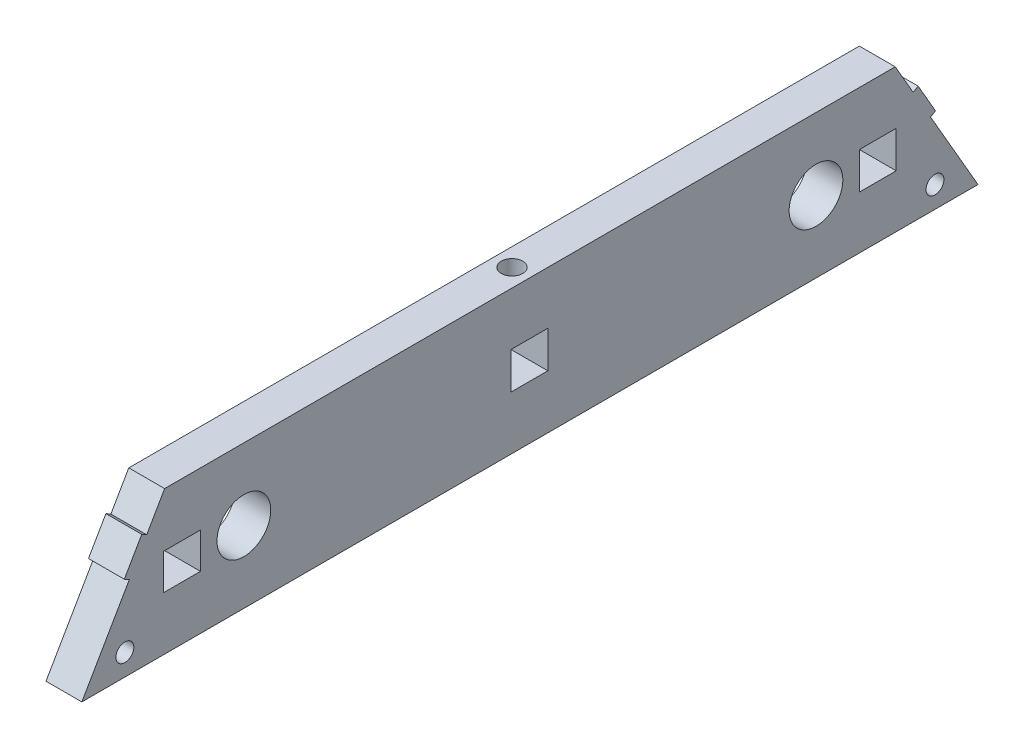
ISO-10303-21;
HEADER;
FILE_DESCRIPTION(('STEP AP214'),'2;1');
FILE_NAME('part.step','',(''),(''),'','','');
FILE_SCHEMA(('AUTOMOTIVE_DESIGN { 1 0 10303 214 1 1 1 1 }'));
ENDSEC;
DATA;
#1=APPLICATION_CONTEXT('core data for automotive mechanical design processes');
#2=APPLICATION_PROTOCOL_DEFINITION('international standard','automotive_design',2000,#1);
#3=PRODUCT_CONTEXT('',#1,'mechanical');
#4=PRODUCT('Part','Part','',(#3));
#5=PRODUCT_RELATED_PRODUCT_CATEGORY('part','',(#4));
#6=PRODUCT_DEFINITION_FORMATION('','',#4);
#7=PRODUCT_DEFINITION_CONTEXT('part definition',#1,'design');
#8=PRODUCT_DEFINITION('design','',#6,#7);
#9=PRODUCT_DEFINITION_SHAPE('','',#8);
#10=(LENGTH_UNIT() NAMED_UNIT(*) SI_UNIT(.MILLI.,.METRE.));
#11=(NAMED_UNIT(*) PLANE_ANGLE_UNIT() SI_UNIT($,.RADIAN.));
#12=(NAMED_UNIT(*) SI_UNIT($,.STERADIAN.) SOLID_ANGLE_UNIT());
#13=UNCERTAINTY_MEASURE_WITH_UNIT(LENGTH_MEASURE(1.E-05),#10,'distance_accuracy_value','');
#14=(GEOMETRIC_REPRESENTATION_CONTEXT(3) GLOBAL_UNCERTAINTY_ASSIGNED_CONTEXT((#13)) GLOBAL_UNIT_ASSIGNED_CONTEXT((#10,
#11,#12)) REPRESENTATION_CONTEXT('',''));
#15=CARTESIAN_POINT('',(0.,0.,0.));
#16=DIRECTION('',(0.,0.,1.));
#17=DIRECTION('',(1.,0.,0.));
#18=AXIS2_PLACEMENT_3D('',#15,#16,#17);
#19=CARTESIAN_POINT('',(6.35,0.,158.75));
#20=DIRECTION('',(0.,-0.500000000000004,-0.866025403784436));
#21=DIRECTION('',(0.,0.866025403784436,-0.500000000000004));
#22=AXIS2_PLACEMENT_3D('',#19,#20,#21);
#23=PLANE('',#22);
#24=DIRECTION('',(1.,0.,0.));
#25=VECTOR('',#24,1.);
#26=CARTESIAN_POINT('',(0.,14.5554566887305,150.346403162583));
#27=LINE('',#26,#25);
#28=CARTESIAN_POINT('',(0.,14.5554566887305,150.346403162583));
#29=VERTEX_POINT('',#28);
#30=CARTESIAN_POINT('',(6.35,14.5554566887305,150.346403162583));
#31=VERTEX_POINT('',#30);
#32=EDGE_CURVE('E405',#29,#31,#27,.T.);
#33=ORIENTED_EDGE('',*,*,#32,.F.);
#34=DIRECTION('',(0.,-0.866025403784436,0.500000000000004));
#35=VECTOR('',#34,1.);
#36=CARTESIAN_POINT('',(0.,0.,158.75));
#37=LINE('',#36,#35);
#38=CARTESIAN_POINT('',(0.,0.,158.75));
#39=VERTEX_POINT('',#38);
#40=EDGE_CURVE('E220',#29,#39,#37,.T.);
#41=ORIENTED_EDGE('',*,*,#40,.T.);
#42=DIRECTION('',(-1.,0.,0.));
#43=VECTOR('',#42,1.);
#44=CARTESIAN_POINT('',(6.35,0.,158.75));
#45=LINE('',#44,#43);
#46=CARTESIAN_POINT('',(6.35,0.,158.75));
#47=VERTEX_POINT('',#46);
#48=EDGE_CURVE('E374',#47,#39,#45,.T.);
#49=ORIENTED_EDGE('',*,*,#48,.F.);
#50=DIRECTION('',(0.,-0.866025403784436,0.500000000000004));
#51=VECTOR('',#50,1.);
#52=CARTESIAN_POINT('',(6.35,0.,158.75));
#53=LINE('',#52,#51);
#54=EDGE_CURVE('E49',#31,#47,#53,.T.);
#55=ORIENTED_EDGE('',*,*,#54,.F.);
#56=EDGE_LOOP('',(#33,#41,#49,#55));
#57=FACE_BOUND('',#56,.T.);
#58=ADVANCED_FACE('F33',(#57),#23,.F.);
#59=DIRECTION('',(-1.,0.,0.));
#60=VECTOR('',#59,1.);
#61=CARTESIAN_POINT('',(0.,19.9007386859688,147.260303162583));
#62=LINE('',#61,#60);
#63=CARTESIAN_POINT('',(6.35,19.9007386859688,147.260303162583));
#64=VERTEX_POINT('',#63);
#65=CARTESIAN_POINT('',(0.,19.9007386859688,147.260303162583));
#66=VERTEX_POINT('',#65);
#67=EDGE_CURVE('E57',#64,#66,#62,.T.);
#68=ORIENTED_EDGE('',*,*,#67,.F.);
#69=CARTESIAN_POINT('',(6.35,25.4,144.085303162583));
#70=VERTEX_POINT('',#69);
#71=EDGE_CURVE('E372',#70,#64,#53,.T.);
#72=ORIENTED_EDGE('',*,*,#71,.F.);
#73=DIRECTION('',(-1.,0.,0.));
#74=VECTOR('',#73,1.);
#75=CARTESIAN_POINT('',(6.35,25.4,144.085303162583));
#76=LINE('',#75,#74);
#77=CARTESIAN_POINT('',(0.,25.4,144.085303162583));
#78=VERTEX_POINT('',#77);
#79=EDGE_CURVE('E385',#70,#78,#76,.T.);
#80=ORIENTED_EDGE('',*,*,#79,.T.);
#81=EDGE_CURVE('E366',#78,#66,#37,.T.);
#82=ORIENTED_EDGE('',*,*,#81,.T.);
#83=EDGE_LOOP('',(#68,#72,#80,#82));
#84=FACE_BOUND('',#83,.T.);
#85=ADVANCED_FACE('F400',(#84),#23,.F.);
#86=CARTESIAN_POINT('',(6.35,0.,0.));
#87=DIRECTION('',(0.,-0.499999999999998,0.86602540378444));
#88=DIRECTION('',(0.,-0.86602540378444,-0.499999999999998));
#89=AXIS2_PLACEMENT_3D('',#86,#87,#88);
#90=PLANE('',#89);
#91=DIRECTION('',(-1.,0.,0.));
#92=VECTOR('',#91,1.);
#93=CARTESIAN_POINT('',(6.35,14.5554566887305,8.40359683741644));
#94=LINE('',#93,#92);
#95=CARTESIAN_POINT('',(6.35,14.5554566887305,8.40359683741644));
#96=VERTEX_POINT('',#95);
#97=CARTESIAN_POINT('',(0.,14.5554566887305,8.40359683741643));
#98=VERTEX_POINT('',#97);
#99=EDGE_CURVE('E221',#96,#98,#94,.T.);
#100=ORIENTED_EDGE('',*,*,#99,.F.);
#101=DIRECTION('',(0.,0.86602540378444,0.499999999999998));
#102=VECTOR('',#101,1.);
#103=CARTESIAN_POINT('',(6.35,0.,0.));
#104=LINE('',#103,#102);
#105=CARTESIAN_POINT('',(6.35,0.,0.));
#106=VERTEX_POINT('',#105);
#107=EDGE_CURVE('E367',#106,#96,#104,.T.);
#108=ORIENTED_EDGE('',*,*,#107,.F.);
#109=DIRECTION('',(-1.,0.,0.));
#110=VECTOR('',#109,1.);
#111=CARTESIAN_POINT('',(6.35,0.,0.));
#112=LINE('',#111,#110);
#113=CARTESIAN_POINT('',(0.,0.,0.));
#114=VERTEX_POINT('',#113);
#115=EDGE_CURVE('E11',#106,#114,#112,.T.);
#116=ORIENTED_EDGE('',*,*,#115,.T.);
#117=DIRECTION('',(0.,0.86602540378444,0.499999999999998));
#118=VECTOR('',#117,1.);
#119=CARTESIAN_POINT('',(0.,0.,0.));
#120=LINE('',#119,#118);
#121=EDGE_CURVE('E378',#114,#98,#120,.T.);
#122=ORIENTED_EDGE('',*,*,#121,.T.);
#123=EDGE_LOOP('',(#100,#108,#116,#122));
#124=FACE_BOUND('',#123,.T.);
#125=ADVANCED_FACE('F489',(#124),#90,.F.);
#126=DIRECTION('',(1.,0.,0.));
#127=VECTOR('',#126,1.);
#128=CARTESIAN_POINT('',(6.35,19.9007386859688,11.4896968374164));
#129=LINE('',#128,#127);
#130=CARTESIAN_POINT('',(0.,19.9007386859688,11.4896968374164));
#131=VERTEX_POINT('',#130);
#132=CARTESIAN_POINT('',(6.35,19.9007386859688,11.4896968374164));
#133=VERTEX_POINT('',#132);
#134=EDGE_CURVE('E224',#131,#133,#129,.T.);
#135=ORIENTED_EDGE('',*,*,#134,.F.);
#136=CARTESIAN_POINT('',(0.,25.4,14.6646968374164));
#137=VERTEX_POINT('',#136);
#138=EDGE_CURVE('E377',#131,#137,#120,.T.);
#139=ORIENTED_EDGE('',*,*,#138,.T.);
#140=DIRECTION('',(-1.,0.,0.));
#141=VECTOR('',#140,1.);
#142=CARTESIAN_POINT('',(6.35,25.4,14.6646968374164));
#143=LINE('',#142,#141);
#144=CARTESIAN_POINT('',(6.35,25.4,14.6646968374164));
#145=VERTEX_POINT('',#144);
#146=EDGE_CURVE('E42',#145,#137,#143,.T.);
#147=ORIENTED_EDGE('',*,*,#146,.F.);
#148=EDGE_CURVE('E365',#133,#145,#104,.T.);
#149=ORIENTED_EDGE('',*,*,#148,.F.);
#150=EDGE_LOOP('',(#135,#139,#147,#149));
#151=FACE_BOUND('',#150,.T.);
#152=ADVANCED_FACE('F437',(#151),#90,.F.);
#153=CARTESIAN_POINT('',(6.35,0.,0.));
#154=DIRECTION('',(-1.,0.,0.));
#155=DIRECTION('',(0.,0.,1.));
#156=AXIS2_PLACEMENT_3D('',#153,#154,#155);
#157=PLANE('',#156);
#158=CARTESIAN_POINT('',(6.35,3.80999999999998,7.62));
#159=DIRECTION('',(1.,0.,0.));
#160=DIRECTION('',(0.,0.,-1.));
#161=AXIS2_PLACEMENT_3D('',#158,#159,#160);
#162=CIRCLE('',#161,1.5875);
#163=CARTESIAN_POINT('',(6.35,3.80999999999998,6.0325));
#164=VERTEX_POINT('',#163);
#165=EDGE_CURVE('E419',#164,#164,#162,.T.);
#166=ORIENTED_EDGE('',*,*,#165,.F.);
#167=EDGE_LOOP('',(#166));
#168=FACE_BOUND('',#167,.T.);
#169=CARTESIAN_POINT('',(6.35,3.80999999999999,151.13));
#170=DIRECTION('',(1.,0.,0.));
#171=DIRECTION('',(0.,0.,-1.));
#172=AXIS2_PLACEMENT_3D('',#169,#170,#171);
#173=CIRCLE('',#172,1.58749999999999);
#174=CARTESIAN_POINT('',(6.35,3.80999999999999,149.5425));
#175=VERTEX_POINT('',#174);
#176=EDGE_CURVE('E413',#175,#175,#173,.T.);
#177=ORIENTED_EDGE('',*,*,#176,.F.);
#178=EDGE_LOOP('',(#177));
#179=FACE_BOUND('',#178,.T.);
#180=DIRECTION('',(0.,0.,-1.));
#181=VECTOR('',#180,1.);
#182=CARTESIAN_POINT('',(6.35,9.52616277871034,137.735303162583));
#183=LINE('',#182,#181);
#184=CARTESIAN_POINT('',(6.35,9.52616277871034,144.263103162583));
#185=VERTEX_POINT('',#184);
#186=CARTESIAN_POINT('',(6.35,9.52616277871034,137.735303162583));
#187=VERTEX_POINT('',#186);
#188=EDGE_CURVE('E288',#185,#187,#183,.T.);
#189=ORIENTED_EDGE('',*,*,#188,.F.);
#190=DIRECTION('',(0.,-1.,0.));
#191=VECTOR('',#190,1.);
#192=CARTESIAN_POINT('',(6.35,9.52616277871034,144.263103162583));
#193=LINE('',#192,#191);
#194=CARTESIAN_POINT('',(6.35,15.875,144.263103162583));
#195=VERTEX_POINT('',#194);
#196=EDGE_CURVE('E296',#195,#185,#193,.T.);
#197=ORIENTED_EDGE('',*,*,#196,.F.);
#198=DIRECTION('',(0.,0.,1.));
#199=VECTOR('',#198,1.);
#200=CARTESIAN_POINT('',(6.35,15.875,137.735303162583));
#201=LINE('',#200,#199);
#202=CARTESIAN_POINT('',(6.35,15.875,137.735303162583));
#203=VERTEX_POINT('',#202);
#204=EDGE_CURVE('E293',#203,#195,#201,.T.);
#205=ORIENTED_EDGE('',*,*,#204,.F.);
#206=DIRECTION('',(0.,1.,0.));
#207=VECTOR('',#206,1.);
#208=CARTESIAN_POINT('',(6.35,9.52616277871034,137.735303162583));
#209=LINE('',#208,#207);
#210=EDGE_CURVE('E290',#187,#203,#209,.T.);
#211=ORIENTED_EDGE('',*,*,#210,.F.);
#212=EDGE_LOOP('',(#189,#197,#205,#211));
#213=FACE_BOUND('',#212,.T.);
#214=CARTESIAN_POINT('',(6.35,12.7,130.048));
#215=DIRECTION('',(1.,0.,0.));
#216=DIRECTION('',(0.,0.,-1.));
#217=AXIS2_PLACEMENT_3D('',#214,#215,#216);
#218=CIRCLE('',#217,4.76250000000001);
#219=CARTESIAN_POINT('',(6.35,12.7,125.2855));
#220=VERTEX_POINT('',#219);
#221=EDGE_CURVE('E325',#220,#220,#218,.T.);
#222=ORIENTED_EDGE('',*,*,#221,.F.);
#223=EDGE_LOOP('',(#222));
#224=FACE_BOUND('',#223,.T.);
#225=DIRECTION('',(0.,0.,-1.));
#226=VECTOR('',#225,1.);
#227=CARTESIAN_POINT('',(6.35,0.,0.));
#228=LINE('',#227,#226);
#229=EDGE_CURVE('E362',#47,#106,#228,.T.);
#230=ORIENTED_EDGE('',*,*,#229,.T.);
#231=ORIENTED_EDGE('',*,*,#107,.T.);
#232=DIRECTION('',(0.,-0.499999999999998,0.86602540378444));
#233=VECTOR('',#232,1.);
#234=CARTESIAN_POINT('',(6.35,15.0634566887305,7.52371502717144));
#235=LINE('',#234,#233);
#236=CARTESIAN_POINT('',(6.35,15.0634566887305,7.52371502717144));
#237=VERTEX_POINT('',#236);
#238=EDGE_CURVE('E250',#237,#96,#235,.T.);
#239=ORIENTED_EDGE('',*,*,#238,.F.);
#240=DIRECTION('',(0.,-0.86602540378444,-0.499999999999998));
#241=VECTOR('',#240,1.);
#242=CARTESIAN_POINT('',(6.35,20.4087386859688,10.6098150271714));
#243=LINE('',#242,#241);
#244=CARTESIAN_POINT('',(6.35,20.4087386859688,10.6098150271714));
#245=VERTEX_POINT('',#244);
#246=EDGE_CURVE('E230',#245,#237,#243,.T.);
#247=ORIENTED_EDGE('',*,*,#246,.F.);
#248=DIRECTION('',(0.,-0.499999999999998,0.86602540378444));
#249=VECTOR('',#248,1.);
#250=CARTESIAN_POINT('',(6.35,20.4087386859688,10.6098150271714));
#251=LINE('',#250,#249);
#252=EDGE_CURVE('E238',#245,#133,#251,.T.);
#253=ORIENTED_EDGE('',*,*,#252,.T.);
#254=ORIENTED_EDGE('',*,*,#148,.T.);
#255=DIRECTION('',(0.,0.,1.));
#256=VECTOR('',#255,1.);
#257=CARTESIAN_POINT('',(6.35,25.4,14.6646968374164));
#258=LINE('',#257,#256);
#259=EDGE_CURVE('E370',#145,#70,#258,.T.);
#260=ORIENTED_EDGE('',*,*,#259,.T.);
#261=ORIENTED_EDGE('',*,*,#71,.T.);
#262=DIRECTION('',(0.,-0.500000000000004,-0.866025403784436));
#263=VECTOR('',#262,1.);
#264=CARTESIAN_POINT('',(6.35,20.4087386859688,148.140184972828));
#265=LINE('',#264,#263);
#266=CARTESIAN_POINT('',(6.35,20.4087386859688,148.140184972828));
#267=VERTEX_POINT('',#266);
#268=EDGE_CURVE('E226',#267,#64,#265,.T.);
#269=ORIENTED_EDGE('',*,*,#268,.F.);
#270=DIRECTION('',(0.,0.866025403784436,-0.500000000000005));
#271=VECTOR('',#270,1.);
#272=CARTESIAN_POINT('',(6.35,20.4087386859688,148.140184972828));
#273=LINE('',#272,#271);
#274=CARTESIAN_POINT('',(6.35,15.0634566887305,151.226284972828));
#275=VERTEX_POINT('',#274);
#276=EDGE_CURVE('E205',#275,#267,#273,.T.);
#277=ORIENTED_EDGE('',*,*,#276,.F.);
#278=DIRECTION('',(0.,-0.500000000000004,-0.866025403784436));
#279=VECTOR('',#278,1.);
#280=CARTESIAN_POINT('',(6.35,15.0634566887305,151.226284972828));
#281=LINE('',#280,#279);
#282=EDGE_CURVE('E202',#275,#31,#281,.T.);
#283=ORIENTED_EDGE('',*,*,#282,.T.);
#284=ORIENTED_EDGE('',*,*,#54,.T.);
#285=EDGE_LOOP('',(#230,#231,#239,#247,#253,#254,#260,#261,#269,#277,#283,#284));
#286=FACE_BOUND('',#285,.T.);
#287=DIRECTION('',(0.,-1.,0.));
#288=VECTOR('',#287,1.);
#289=CARTESIAN_POINT('',(6.35,9.34719999999998,21.0146968374163));
#290=LINE('',#289,#288);
#291=CARTESIAN_POINT('',(6.35,15.875,21.0146968374163));
#292=VERTEX_POINT('',#291);
#293=CARTESIAN_POINT('',(6.35,9.34719999999998,21.0146968374163));
#294=VERTEX_POINT('',#293);
#295=EDGE_CURVE('E331',#292,#294,#290,.T.);
#296=ORIENTED_EDGE('',*,*,#295,.F.);
#297=DIRECTION('',(0.,0.,1.));
#298=VECTOR('',#297,1.);
#299=CARTESIAN_POINT('',(6.35,15.875,21.0146968374163));
#300=LINE('',#299,#298);
#301=CARTESIAN_POINT('',(6.35,15.875,14.4868968374164));
#302=VERTEX_POINT('',#301);
#303=EDGE_CURVE('E339',#302,#292,#300,.T.);
#304=ORIENTED_EDGE('',*,*,#303,.F.);
#305=DIRECTION('',(0.,1.,0.));
#306=VECTOR('',#305,1.);
#307=CARTESIAN_POINT('',(6.35,9.34719999999998,14.4868968374164));
#308=LINE('',#307,#306);
#309=CARTESIAN_POINT('',(6.35,9.34719999999998,14.4868968374164));
#310=VERTEX_POINT('',#309);
#311=EDGE_CURVE('E336',#310,#302,#308,.T.);
#312=ORIENTED_EDGE('',*,*,#311,.F.);
#313=DIRECTION('',(0.,0.,-1.));
#314=VECTOR('',#313,1.);
#315=CARTESIAN_POINT('',(6.35,9.34719999999998,21.0146968374163));
#316=LINE('',#315,#314);
#317=EDGE_CURVE('E333',#294,#310,#316,.T.);
#318=ORIENTED_EDGE('',*,*,#317,.F.);
#319=EDGE_LOOP('',(#296,#304,#312,#318));
#320=FACE_BOUND('',#319,.T.);
#321=CARTESIAN_POINT('',(6.35,12.7,28.702));
#322=DIRECTION('',(1.,0.,0.));
#323=DIRECTION('',(0.,0.,-1.));
#324=AXIS2_PLACEMENT_3D('',#321,#322,#323);
#325=CIRCLE('',#324,4.7625);
#326=CARTESIAN_POINT('',(6.35,12.7,23.9395));
#327=VERTEX_POINT('',#326);
#328=EDGE_CURVE('E319',#327,#327,#325,.T.);
#329=ORIENTED_EDGE('',*,*,#328,.F.);
#330=EDGE_LOOP('',(#329));
#331=FACE_BOUND('',#330,.T.);
#332=DIRECTION('',(0.,1.,0.));
#333=VECTOR('',#332,1.);
#334=CARTESIAN_POINT('',(6.35,16.0527999999999,76.2));
#335=LINE('',#334,#333);
#336=CARTESIAN_POINT('',(6.35,9.52499999999995,76.2));
#337=VERTEX_POINT('',#336);
#338=CARTESIAN_POINT('',(6.35,16.0527999999999,76.2));
#339=VERTEX_POINT('',#338);
#340=EDGE_CURVE('E256',#337,#339,#335,.T.);
#341=ORIENTED_EDGE('',*,*,#340,.F.);
#342=DIRECTION('',(0.,0.,-1.));
#343=VECTOR('',#342,1.);
#344=CARTESIAN_POINT('',(6.35,9.52499999999995,76.2));
#345=LINE('',#344,#343);
#346=CARTESIAN_POINT('',(6.35,9.52499999999995,82.7278));
#347=VERTEX_POINT('',#346);
#348=EDGE_CURVE('E264',#347,#337,#345,.T.);
#349=ORIENTED_EDGE('',*,*,#348,.F.);
#350=DIRECTION('',(0.,-1.,0.));
#351=VECTOR('',#350,1.);
#352=CARTESIAN_POINT('',(6.35,16.0528,82.7278));
#353=LINE('',#352,#351);
#354=CARTESIAN_POINT('',(6.35,16.0528,82.7278));
#355=VERTEX_POINT('',#354);
#356=EDGE_CURVE('E261',#355,#347,#353,.T.);
#357=ORIENTED_EDGE('',*,*,#356,.F.);
#358=DIRECTION('',(0.,0.,1.));
#359=VECTOR('',#358,1.);
#360=CARTESIAN_POINT('',(6.35,16.0527999999999,76.2));
#361=LINE('',#360,#359);
#362=EDGE_CURVE('E258',#339,#355,#361,.T.);
#363=ORIENTED_EDGE('',*,*,#362,.F.);
#364=EDGE_LOOP('',(#341,#349,#357,#363));
#365=FACE_BOUND('',#364,.T.);
#366=ADVANCED_FACE('F434',(#168,#179,#213,#224,#286,#320,#331,#365),#157,.F.);
#367=CARTESIAN_POINT('',(0.,0.,0.));
#368=DIRECTION('',(-1.,0.,0.));
#369=DIRECTION('',(0.,0.,1.));
#370=AXIS2_PLACEMENT_3D('',#367,#368,#369);
#371=PLANE('',#370);
#372=CARTESIAN_POINT('',(0.,3.80999999999998,7.62));
#373=DIRECTION('',(1.,0.,0.));
#374=DIRECTION('',(0.,0.,-1.));
#375=AXIS2_PLACEMENT_3D('',#372,#373,#374);
#376=CIRCLE('',#375,1.5875);
#377=CARTESIAN_POINT('',(0.,3.80999999999998,6.0325));
#378=VERTEX_POINT('',#377);
#379=EDGE_CURVE('E416',#378,#378,#376,.T.);
#380=ORIENTED_EDGE('',*,*,#379,.T.);
#381=EDGE_LOOP('',(#380));
#382=FACE_BOUND('',#381,.T.);
#383=CARTESIAN_POINT('',(0.,3.80999999999999,151.13));
#384=DIRECTION('',(1.,0.,0.));
#385=DIRECTION('',(0.,0.,-1.));
#386=AXIS2_PLACEMENT_3D('',#383,#384,#385);
#387=CIRCLE('',#386,1.58749999999999);
#388=CARTESIAN_POINT('',(0.,3.80999999999999,149.5425));
#389=VERTEX_POINT('',#388);
#390=EDGE_CURVE('E407',#389,#389,#387,.T.);
#391=ORIENTED_EDGE('',*,*,#390,.T.);
#392=EDGE_LOOP('',(#391));
#393=FACE_BOUND('',#392,.T.);
#394=DIRECTION('',(0.,-1.,0.));
#395=VECTOR('',#394,1.);
#396=CARTESIAN_POINT('',(0.,9.52616277871034,144.263103162583));
#397=LINE('',#396,#395);
#398=CARTESIAN_POINT('',(0.,15.875,144.263103162583));
#399=VERTEX_POINT('',#398);
#400=CARTESIAN_POINT('',(0.,9.52616277871034,144.263103162583));
#401=VERTEX_POINT('',#400);
#402=EDGE_CURVE('E291',#399,#401,#397,.T.);
#403=ORIENTED_EDGE('',*,*,#402,.T.);
#404=DIRECTION('',(0.,0.,-1.));
#405=VECTOR('',#404,1.);
#406=CARTESIAN_POINT('',(0.,9.52616277871034,137.735303162583));
#407=LINE('',#406,#405);
#408=CARTESIAN_POINT('',(0.,9.52616277871034,137.735303162583));
#409=VERTEX_POINT('',#408);
#410=EDGE_CURVE('E287',#401,#409,#407,.T.);
#411=ORIENTED_EDGE('',*,*,#410,.T.);
#412=DIRECTION('',(0.,1.,0.));
#413=VECTOR('',#412,1.);
#414=CARTESIAN_POINT('',(0.,9.52616277871034,137.735303162583));
#415=LINE('',#414,#413);
#416=CARTESIAN_POINT('',(0.,15.875,137.735303162583));
#417=VERTEX_POINT('',#416);
#418=EDGE_CURVE('E301',#409,#417,#415,.T.);
#419=ORIENTED_EDGE('',*,*,#418,.T.);
#420=DIRECTION('',(0.,0.,1.));
#421=VECTOR('',#420,1.);
#422=CARTESIAN_POINT('',(0.,15.875,137.735303162583));
#423=LINE('',#422,#421);
#424=EDGE_CURVE('E304',#417,#399,#423,.T.);
#425=ORIENTED_EDGE('',*,*,#424,.T.);
#426=EDGE_LOOP('',(#403,#411,#419,#425));
#427=FACE_BOUND('',#426,.T.);
#428=CARTESIAN_POINT('',(0.,12.7,130.048));
#429=DIRECTION('',(1.,0.,0.));
#430=DIRECTION('',(0.,0.,-1.));
#431=AXIS2_PLACEMENT_3D('',#428,#429,#430);
#432=CIRCLE('',#431,4.76250000000001);
#433=CARTESIAN_POINT('',(0.,12.7,125.2855));
#434=VERTEX_POINT('',#433);
#435=EDGE_CURVE('E322',#434,#434,#432,.T.);
#436=ORIENTED_EDGE('',*,*,#435,.T.);
#437=EDGE_LOOP('',(#436));
#438=FACE_BOUND('',#437,.T.);
#439=DIRECTION('',(0.,0.,-1.));
#440=VECTOR('',#439,1.);
#441=CARTESIAN_POINT('',(0.,0.,0.));
#442=LINE('',#441,#440);
#443=EDGE_CURVE('E361',#39,#114,#442,.T.);
#444=ORIENTED_EDGE('',*,*,#443,.F.);
#445=ORIENTED_EDGE('',*,*,#40,.F.);
#446=DIRECTION('',(0.,-0.500000000000004,-0.866025403784436));
#447=VECTOR('',#446,1.);
#448=CARTESIAN_POINT('',(0.,15.0634566887305,151.226284972828));
#449=LINE('',#448,#447);
#450=CARTESIAN_POINT('',(0.,15.0634566887305,151.226284972828));
#451=VERTEX_POINT('',#450);
#452=EDGE_CURVE('E200',#451,#29,#449,.T.);
#453=ORIENTED_EDGE('',*,*,#452,.F.);
#454=DIRECTION('',(0.,-0.866025403784436,0.500000000000005));
#455=VECTOR('',#454,1.);
#456=CARTESIAN_POINT('',(0.,20.4087386859688,148.140184972828));
#457=LINE('',#456,#455);
#458=CARTESIAN_POINT('',(0.,20.4087386859688,148.140184972828));
#459=VERTEX_POINT('',#458);
#460=EDGE_CURVE('E206',#459,#451,#457,.T.);
#461=ORIENTED_EDGE('',*,*,#460,.F.);
#462=DIRECTION('',(0.,-0.500000000000004,-0.866025403784436));
#463=VECTOR('',#462,1.);
#464=CARTESIAN_POINT('',(0.,20.4087386859688,148.140184972828));
#465=LINE('',#464,#463);
#466=EDGE_CURVE('E399',#459,#66,#465,.T.);
#467=ORIENTED_EDGE('',*,*,#466,.T.);
#468=ORIENTED_EDGE('',*,*,#81,.F.);
#469=DIRECTION('',(0.,0.,1.));
#470=VECTOR('',#469,1.);
#471=CARTESIAN_POINT('',(0.,25.4,14.6646968374164));
#472=LINE('',#471,#470);
#473=EDGE_CURVE('E380',#137,#78,#472,.T.);
#474=ORIENTED_EDGE('',*,*,#473,.F.);
#475=ORIENTED_EDGE('',*,*,#138,.F.);
#476=DIRECTION('',(0.,-0.499999999999998,0.86602540378444));
#477=VECTOR('',#476,1.);
#478=CARTESIAN_POINT('',(0.,20.4087386859688,10.6098150271714));
#479=LINE('',#478,#477);
#480=CARTESIAN_POINT('',(0.,20.4087386859688,10.6098150271714));
#481=VERTEX_POINT('',#480);
#482=EDGE_CURVE('E244',#481,#131,#479,.T.);
#483=ORIENTED_EDGE('',*,*,#482,.F.);
#484=DIRECTION('',(0.,0.86602540378444,0.499999999999998));
#485=VECTOR('',#484,1.);
#486=CARTESIAN_POINT('',(0.,20.4087386859688,10.6098150271714));
#487=LINE('',#486,#485);
#488=CARTESIAN_POINT('',(0.,15.0634566887305,7.52371502717144));
#489=VERTEX_POINT('',#488);
#490=EDGE_CURVE('E235',#489,#481,#487,.T.);
#491=ORIENTED_EDGE('',*,*,#490,.F.);
#492=DIRECTION('',(0.,-0.499999999999998,0.86602540378444));
#493=VECTOR('',#492,1.);
#494=CARTESIAN_POINT('',(0.,15.0634566887305,7.52371502717144));
#495=LINE('',#494,#493);
#496=EDGE_CURVE('E247',#489,#98,#495,.T.);
#497=ORIENTED_EDGE('',*,*,#496,.T.);
#498=ORIENTED_EDGE('',*,*,#121,.F.);
#499=EDGE_LOOP('',(#444,#445,#453,#461,#467,#468,#474,#475,#483,#491,#497,#498));
#500=FACE_BOUND('',#499,.T.);
#501=DIRECTION('',(0.,0.,1.));
#502=VECTOR('',#501,1.);
#503=CARTESIAN_POINT('',(0.,15.875,21.0146968374163));
#504=LINE('',#503,#502);
#505=CARTESIAN_POINT('',(0.,15.875,14.4868968374164));
#506=VERTEX_POINT('',#505);
#507=CARTESIAN_POINT('',(0.,15.875,21.0146968374163));
#508=VERTEX_POINT('',#507);
#509=EDGE_CURVE('E334',#506,#508,#504,.T.);
#510=ORIENTED_EDGE('',*,*,#509,.T.);
#511=DIRECTION('',(0.,-1.,0.));
#512=VECTOR('',#511,1.);
#513=CARTESIAN_POINT('',(0.,9.34719999999998,21.0146968374163));
#514=LINE('',#513,#512);
#515=CARTESIAN_POINT('',(0.,9.34719999999998,21.0146968374163));
#516=VERTEX_POINT('',#515);
#517=EDGE_CURVE('E328',#508,#516,#514,.T.);
#518=ORIENTED_EDGE('',*,*,#517,.T.);
#519=DIRECTION('',(0.,0.,-1.));
#520=VECTOR('',#519,1.);
#521=CARTESIAN_POINT('',(0.,9.34719999999998,21.0146968374163));
#522=LINE('',#521,#520);
#523=CARTESIAN_POINT('',(0.,9.34719999999998,14.4868968374164));
#524=VERTEX_POINT('',#523);
#525=EDGE_CURVE('E344',#516,#524,#522,.T.);
#526=ORIENTED_EDGE('',*,*,#525,.T.);
#527=DIRECTION('',(0.,1.,0.));
#528=VECTOR('',#527,1.);
#529=CARTESIAN_POINT('',(0.,9.34719999999998,14.4868968374164));
#530=LINE('',#529,#528);
#531=EDGE_CURVE('E347',#524,#506,#530,.T.);
#532=ORIENTED_EDGE('',*,*,#531,.T.);
#533=EDGE_LOOP('',(#510,#518,#526,#532));
#534=FACE_BOUND('',#533,.T.);
#535=CARTESIAN_POINT('',(0.,12.7,28.702));
#536=DIRECTION('',(1.,0.,0.));
#537=DIRECTION('',(0.,0.,-1.));
#538=AXIS2_PLACEMENT_3D('',#535,#536,#537);
#539=CIRCLE('',#538,4.7625);
#540=CARTESIAN_POINT('',(0.,12.7,23.9395));
#541=VERTEX_POINT('',#540);
#542=EDGE_CURVE('E318',#541,#541,#539,.T.);
#543=ORIENTED_EDGE('',*,*,#542,.T.);
#544=EDGE_LOOP('',(#543));
#545=FACE_BOUND('',#544,.T.);
#546=DIRECTION('',(0.,0.,-1.));
#547=VECTOR('',#546,1.);
#548=CARTESIAN_POINT('',(0.,9.52499999999995,76.2));
#549=LINE('',#548,#547);
#550=CARTESIAN_POINT('',(0.,9.52499999999995,82.7278));
#551=VERTEX_POINT('',#550);
#552=CARTESIAN_POINT('',(0.,9.52499999999995,76.2));
#553=VERTEX_POINT('',#552);
#554=EDGE_CURVE('E259',#551,#553,#549,.T.);
#555=ORIENTED_EDGE('',*,*,#554,.T.);
#556=DIRECTION('',(0.,1.,0.));
#557=VECTOR('',#556,1.);
#558=CARTESIAN_POINT('',(0.,16.0527999999999,76.2));
#559=LINE('',#558,#557);
#560=CARTESIAN_POINT('',(0.,16.0527999999999,76.2));
#561=VERTEX_POINT('',#560);
#562=EDGE_CURVE('E267',#553,#561,#559,.T.);
#563=ORIENTED_EDGE('',*,*,#562,.T.);
#564=DIRECTION('',(0.,0.,1.));
#565=VECTOR('',#564,1.);
#566=CARTESIAN_POINT('',(0.,16.0527999999999,76.2));
#567=LINE('',#566,#565);
#568=CARTESIAN_POINT('',(0.,16.0528,82.7278));
#569=VERTEX_POINT('',#568);
#570=EDGE_CURVE('E270',#561,#569,#567,.T.);
#571=ORIENTED_EDGE('',*,*,#570,.T.);
#572=DIRECTION('',(0.,-1.,0.));
#573=VECTOR('',#572,1.);
#574=CARTESIAN_POINT('',(0.,16.0528,82.7278));
#575=LINE('',#574,#573);
#576=EDGE_CURVE('E273',#569,#551,#575,.T.);
#577=ORIENTED_EDGE('',*,*,#576,.T.);
#578=EDGE_LOOP('',(#555,#563,#571,#577));
#579=FACE_BOUND('',#578,.T.);
#580=ADVANCED_FACE('F218',(#382,#393,#427,#438,#500,#534,#545,#579),#371,.T.);
#581=CARTESIAN_POINT('',(6.35,0.,0.));
#582=DIRECTION('',(0.,1.,0.));
#583=DIRECTION('',(0.,0.,1.));
#584=AXIS2_PLACEMENT_3D('',#581,#582,#583);
#585=PLANE('',#584);
#586=ORIENTED_EDGE('',*,*,#443,.T.);
#587=ORIENTED_EDGE('',*,*,#115,.F.);
#588=ORIENTED_EDGE('',*,*,#229,.F.);
#589=ORIENTED_EDGE('',*,*,#48,.T.);
#590=EDGE_LOOP('',(#586,#587,#588,#589));
#591=FACE_BOUND('',#590,.T.);
#592=ADVANCED_FACE('F35',(#591),#585,.F.);
#593=CARTESIAN_POINT('',(6.35,25.4,14.6646968374164));
#594=DIRECTION('',(0.,-1.,0.));
#595=DIRECTION('',(0.,0.,-1.));
#596=AXIS2_PLACEMENT_3D('',#593,#594,#595);
#597=PLANE('',#596);
#598=CARTESIAN_POINT('',(3.175,25.4,79.375));
#599=DIRECTION('',(0.,1.,0.));
#600=DIRECTION('',(0.,0.,1.));
#601=AXIS2_PLACEMENT_3D('',#598,#599,#600);
#602=CIRCLE('',#601,1.89865);
#603=CARTESIAN_POINT('',(3.175,25.4,81.27365));
#604=VERTEX_POINT('',#603);
#605=EDGE_CURVE('E253',#604,#604,#602,.T.);
#606=ORIENTED_EDGE('',*,*,#605,.F.);
#607=EDGE_LOOP('',(#606));
#608=FACE_BOUND('',#607,.T.);
#609=ORIENTED_EDGE('',*,*,#473,.T.);
#610=ORIENTED_EDGE('',*,*,#79,.F.);
#611=ORIENTED_EDGE('',*,*,#259,.F.);
#612=ORIENTED_EDGE('',*,*,#146,.T.);
#613=EDGE_LOOP('',(#609,#610,#611,#612));
#614=FACE_BOUND('',#613,.T.);
#615=ADVANCED_FACE('F393',(#608,#614),#597,.F.);
#616=CARTESIAN_POINT('',(6.35,9.34719999999998,21.0146968374163));
#617=DIRECTION('',(0.,0.,-1.));
#618=DIRECTION('',(-1.,0.,0.));
#619=AXIS2_PLACEMENT_3D('',#616,#617,#618);
#620=PLANE('',#619);
#621=ORIENTED_EDGE('',*,*,#517,.F.);
#622=DIRECTION('',(-1.,0.,0.));
#623=VECTOR('',#622,1.);
#624=CARTESIAN_POINT('',(6.35,15.875,21.0146968374163));
#625=LINE('',#624,#623);
#626=EDGE_CURVE('E341',#292,#508,#625,.T.);
#627=ORIENTED_EDGE('',*,*,#626,.F.);
#628=ORIENTED_EDGE('',*,*,#295,.T.);
#629=DIRECTION('',(-1.,0.,0.));
#630=VECTOR('',#629,1.);
#631=CARTESIAN_POINT('',(6.35,9.34719999999998,21.0146968374163));
#632=LINE('',#631,#630);
#633=EDGE_CURVE('E358',#294,#516,#632,.T.);
#634=ORIENTED_EDGE('',*,*,#633,.T.);
#635=EDGE_LOOP('',(#621,#627,#628,#634));
#636=FACE_BOUND('',#635,.T.);
#637=ADVANCED_FACE('F493',(#636),#620,.T.);
#638=CARTESIAN_POINT('',(6.35,9.34719999999998,21.0146968374163));
#639=DIRECTION('',(0.,1.,0.));
#640=DIRECTION('',(0.,0.,1.));
#641=AXIS2_PLACEMENT_3D('',#638,#639,#640);
#642=PLANE('',#641);
#643=ORIENTED_EDGE('',*,*,#525,.F.);
#644=ORIENTED_EDGE('',*,*,#633,.F.);
#645=ORIENTED_EDGE('',*,*,#317,.T.);
#646=DIRECTION('',(-1.,0.,0.));
#647=VECTOR('',#646,1.);
#648=CARTESIAN_POINT('',(6.35,9.34719999999998,14.4868968374164));
#649=LINE('',#648,#647);
#650=EDGE_CURVE('E356',#310,#524,#649,.T.);
#651=ORIENTED_EDGE('',*,*,#650,.T.);
#652=EDGE_LOOP('',(#643,#644,#645,#651));
#653=FACE_BOUND('',#652,.T.);
#654=ADVANCED_FACE('F710',(#653),#642,.T.);
#655=CARTESIAN_POINT('',(6.35,9.34719999999998,14.4868968374164));
#656=DIRECTION('',(0.,0.,1.));
#657=DIRECTION('',(1.,0.,0.));
#658=AXIS2_PLACEMENT_3D('',#655,#656,#657);
#659=PLANE('',#658);
#660=ORIENTED_EDGE('',*,*,#531,.F.);
#661=ORIENTED_EDGE('',*,*,#650,.F.);
#662=ORIENTED_EDGE('',*,*,#311,.T.);
#663=DIRECTION('',(-1.,0.,0.));
#664=VECTOR('',#663,1.);
#665=CARTESIAN_POINT('',(6.35,15.875,14.4868968374164));
#666=LINE('',#665,#664);
#667=EDGE_CURVE('E354',#302,#506,#666,.T.);
#668=ORIENTED_EDGE('',*,*,#667,.T.);
#669=EDGE_LOOP('',(#660,#661,#662,#668));
#670=FACE_BOUND('',#669,.T.);
#671=ADVANCED_FACE('F702',(#670),#659,.T.);
#672=CARTESIAN_POINT('',(6.35,15.875,21.0146968374163));
#673=DIRECTION('',(0.,-1.,0.));
#674=DIRECTION('',(0.,0.,-1.));
#675=AXIS2_PLACEMENT_3D('',#672,#673,#674);
#676=PLANE('',#675);
#677=ORIENTED_EDGE('',*,*,#509,.F.);
#678=ORIENTED_EDGE('',*,*,#667,.F.);
#679=ORIENTED_EDGE('',*,*,#303,.T.);
#680=ORIENTED_EDGE('',*,*,#626,.T.);
#681=EDGE_LOOP('',(#677,#678,#679,#680));
#682=FACE_BOUND('',#681,.T.);
#683=ADVANCED_FACE('F694',(#682),#676,.T.);
#684=CARTESIAN_POINT('',(6.35,12.7,130.048));
#685=DIRECTION('',(-1.,0.,0.));
#686=DIRECTION('',(0.,0.,1.));
#687=AXIS2_PLACEMENT_3D('',#684,#685,#686);
#688=CYLINDRICAL_SURFACE('',#687,4.76250000000001);
#689=ORIENTED_EDGE('',*,*,#221,.T.);
#690=EDGE_LOOP('',(#689));
#691=FACE_BOUND('',#690,.T.);
#692=ORIENTED_EDGE('',*,*,#435,.F.);
#693=EDGE_LOOP('',(#692));
#694=FACE_BOUND('',#693,.T.);
#695=ADVANCED_FACE('F686',(#691,#694),#688,.F.);
#696=CARTESIAN_POINT('',(6.35,12.7,28.702));
#697=DIRECTION('',(-1.,0.,0.));
#698=DIRECTION('',(0.,0.,1.));
#699=AXIS2_PLACEMENT_3D('',#696,#697,#698);
#700=CYLINDRICAL_SURFACE('',#699,4.7625);
#701=ORIENTED_EDGE('',*,*,#328,.T.);
#702=EDGE_LOOP('',(#701));
#703=FACE_BOUND('',#702,.T.);
#704=ORIENTED_EDGE('',*,*,#542,.F.);
#705=EDGE_LOOP('',(#704));
#706=FACE_BOUND('',#705,.T.);
#707=ADVANCED_FACE('F678',(#703,#706),#700,.F.);
#708=CARTESIAN_POINT('',(6.35,9.52616277871034,137.735303162583));
#709=DIRECTION('',(0.,1.,0.));
#710=DIRECTION('',(0.,0.,1.));
#711=AXIS2_PLACEMENT_3D('',#708,#709,#710);
#712=PLANE('',#711);
#713=ORIENTED_EDGE('',*,*,#410,.F.);
#714=DIRECTION('',(-1.,0.,0.));
#715=VECTOR('',#714,1.);
#716=CARTESIAN_POINT('',(6.35,9.52616277871034,144.263103162583));
#717=LINE('',#716,#715);
#718=EDGE_CURVE('E298',#185,#401,#717,.T.);
#719=ORIENTED_EDGE('',*,*,#718,.F.);
#720=ORIENTED_EDGE('',*,*,#188,.T.);
#721=DIRECTION('',(-1.,0.,0.));
#722=VECTOR('',#721,1.);
#723=CARTESIAN_POINT('',(6.35,9.52616277871034,137.735303162583));
#724=LINE('',#723,#722);
#725=EDGE_CURVE('E315',#187,#409,#724,.T.);
#726=ORIENTED_EDGE('',*,*,#725,.T.);
#727=EDGE_LOOP('',(#713,#719,#720,#726));
#728=FACE_BOUND('',#727,.T.);
#729=ADVANCED_FACE('F670',(#728),#712,.T.);
#730=CARTESIAN_POINT('',(6.35,9.52616277871034,137.735303162583));
#731=DIRECTION('',(0.,0.,1.));
#732=DIRECTION('',(1.,0.,0.));
#733=AXIS2_PLACEMENT_3D('',#730,#731,#732);
#734=PLANE('',#733);
#735=ORIENTED_EDGE('',*,*,#418,.F.);
#736=ORIENTED_EDGE('',*,*,#725,.F.);
#737=ORIENTED_EDGE('',*,*,#210,.T.);
#738=DIRECTION('',(-1.,0.,0.));
#739=VECTOR('',#738,1.);
#740=CARTESIAN_POINT('',(6.35,15.875,137.735303162583));
#741=LINE('',#740,#739);
#742=EDGE_CURVE('E313',#203,#417,#741,.T.);
#743=ORIENTED_EDGE('',*,*,#742,.T.);
#744=EDGE_LOOP('',(#735,#736,#737,#743));
#745=FACE_BOUND('',#744,.T.);
#746=ADVANCED_FACE('F662',(#745),#734,.T.);
#747=CARTESIAN_POINT('',(6.35,15.875,137.735303162583));
#748=DIRECTION('',(0.,-1.,0.));
#749=DIRECTION('',(0.,0.,-1.));
#750=AXIS2_PLACEMENT_3D('',#747,#748,#749);
#751=PLANE('',#750);
#752=ORIENTED_EDGE('',*,*,#424,.F.);
#753=ORIENTED_EDGE('',*,*,#742,.F.);
#754=ORIENTED_EDGE('',*,*,#204,.T.);
#755=DIRECTION('',(-1.,0.,0.));
#756=VECTOR('',#755,1.);
#757=CARTESIAN_POINT('',(6.35,15.875,144.263103162583));
#758=LINE('',#757,#756);
#759=EDGE_CURVE('E311',#195,#399,#758,.T.);
#760=ORIENTED_EDGE('',*,*,#759,.T.);
#761=EDGE_LOOP('',(#752,#753,#754,#760));
#762=FACE_BOUND('',#761,.T.);
#763=ADVANCED_FACE('F654',(#762),#751,.T.);
#764=CARTESIAN_POINT('',(6.35,9.52616277871034,144.263103162583));
#765=DIRECTION('',(0.,0.,-1.));
#766=DIRECTION('',(-1.,0.,0.));
#767=AXIS2_PLACEMENT_3D('',#764,#765,#766);
#768=PLANE('',#767);
#769=ORIENTED_EDGE('',*,*,#402,.F.);
#770=ORIENTED_EDGE('',*,*,#759,.F.);
#771=ORIENTED_EDGE('',*,*,#196,.T.);
#772=ORIENTED_EDGE('',*,*,#718,.T.);
#773=EDGE_LOOP('',(#769,#770,#771,#772));
#774=FACE_BOUND('',#773,.T.);
#775=ADVANCED_FACE('F648',(#774),#768,.T.);
#776=CARTESIAN_POINT('',(6.35,16.0527999999999,76.2));
#777=DIRECTION('',(0.,0.,1.));
#778=DIRECTION('',(1.,0.,0.));
#779=AXIS2_PLACEMENT_3D('',#776,#777,#778);
#780=PLANE('',#779);
#781=ORIENTED_EDGE('',*,*,#562,.F.);
#782=DIRECTION('',(-1.,0.,0.));
#783=VECTOR('',#782,1.);
#784=CARTESIAN_POINT('',(6.35,9.52499999999995,76.2));
#785=LINE('',#784,#783);
#786=EDGE_CURVE('E266',#337,#553,#785,.T.);
#787=ORIENTED_EDGE('',*,*,#786,.F.);
#788=ORIENTED_EDGE('',*,*,#340,.T.);
#789=DIRECTION('',(-1.,0.,0.));
#790=VECTOR('',#789,1.);
#791=CARTESIAN_POINT('',(6.35,16.0527999999999,76.2));
#792=LINE('',#791,#790);
#793=EDGE_CURVE('E284',#339,#561,#792,.T.);
#794=ORIENTED_EDGE('',*,*,#793,.T.);
#795=EDGE_LOOP('',(#781,#787,#788,#794));
#796=FACE_BOUND('',#795,.T.);
#797=ADVANCED_FACE('F463',(#796),#780,.T.);
#798=CARTESIAN_POINT('',(6.35,16.0527999999999,76.2));
#799=DIRECTION('',(0.,-1.,0.));
#800=DIRECTION('',(0.,0.,-1.));
#801=AXIS2_PLACEMENT_3D('',#798,#799,#800);
#802=PLANE('',#801);
#803=CARTESIAN_POINT('',(3.175,16.0528,79.375));
#804=DIRECTION('',(0.,-1.,0.));
#805=DIRECTION('',(0.,0.,-1.));
#806=AXIS2_PLACEMENT_3D('',#803,#804,#805);
#807=CIRCLE('',#806,1.89865);
#808=CARTESIAN_POINT('',(3.175,16.0528,77.47635));
#809=VERTEX_POINT('',#808);
#810=EDGE_CURVE('E37',#809,#809,#807,.T.);
#811=ORIENTED_EDGE('',*,*,#810,.F.);
#812=EDGE_LOOP('',(#811));
#813=FACE_BOUND('',#812,.T.);
#814=ORIENTED_EDGE('',*,*,#570,.F.);
#815=ORIENTED_EDGE('',*,*,#793,.F.);
#816=ORIENTED_EDGE('',*,*,#362,.T.);
#817=DIRECTION('',(-1.,0.,0.));
#818=VECTOR('',#817,1.);
#819=CARTESIAN_POINT('',(6.35,16.0528,82.7278));
#820=LINE('',#819,#818);
#821=EDGE_CURVE('E282',#355,#569,#820,.T.);
#822=ORIENTED_EDGE('',*,*,#821,.T.);
#823=EDGE_LOOP('',(#814,#815,#816,#822));
#824=FACE_BOUND('',#823,.T.);
#825=ADVANCED_FACE('F465',(#813,#824),#802,.T.);
#826=CARTESIAN_POINT('',(6.35,16.0528,82.7278));
#827=DIRECTION('',(0.,0.,-1.));
#828=DIRECTION('',(-1.,0.,0.));
#829=AXIS2_PLACEMENT_3D('',#826,#827,#828);
#830=PLANE('',#829);
#831=ORIENTED_EDGE('',*,*,#576,.F.);
#832=ORIENTED_EDGE('',*,*,#821,.F.);
#833=ORIENTED_EDGE('',*,*,#356,.T.);
#834=DIRECTION('',(-1.,0.,0.));
#835=VECTOR('',#834,1.);
#836=CARTESIAN_POINT('',(6.35,9.52499999999995,82.7278));
#837=LINE('',#836,#835);
#838=EDGE_CURVE('E280',#347,#551,#837,.T.);
#839=ORIENTED_EDGE('',*,*,#838,.T.);
#840=EDGE_LOOP('',(#831,#832,#833,#839));
#841=FACE_BOUND('',#840,.T.);
#842=ADVANCED_FACE('F473',(#841),#830,.T.);
#843=CARTESIAN_POINT('',(6.35,9.52499999999995,76.2));
#844=DIRECTION('',(0.,1.,0.));
#845=DIRECTION('',(0.,0.,1.));
#846=AXIS2_PLACEMENT_3D('',#843,#844,#845);
#847=PLANE('',#846);
#848=ORIENTED_EDGE('',*,*,#554,.F.);
#849=ORIENTED_EDGE('',*,*,#838,.F.);
#850=ORIENTED_EDGE('',*,*,#348,.T.);
#851=ORIENTED_EDGE('',*,*,#786,.T.);
#852=EDGE_LOOP('',(#848,#849,#850,#851));
#853=FACE_BOUND('',#852,.T.);
#854=ADVANCED_FACE('F471',(#853),#847,.T.);
#855=CARTESIAN_POINT('',(3.175,25.4,79.375));
#856=DIRECTION('',(0.,1.,0.));
#857=DIRECTION('',(0.,0.,1.));
#858=AXIS2_PLACEMENT_3D('',#855,#856,#857);
#859=CYLINDRICAL_SURFACE('',#858,1.89865);
#860=ORIENTED_EDGE('',*,*,#810,.T.);
#861=EDGE_LOOP('',(#860));
#862=FACE_BOUND('',#861,.T.);
#863=ORIENTED_EDGE('',*,*,#605,.T.);
#864=EDGE_LOOP('',(#863));
#865=FACE_BOUND('',#864,.T.);
#866=ADVANCED_FACE('F480',(#862,#865),#859,.F.);
#867=CARTESIAN_POINT('',(6.35,15.0634566887305,7.52371502717144));
#868=DIRECTION('',(0.,0.86602540378444,0.499999999999998));
#869=DIRECTION('',(0.,-0.499999999999998,0.86602540378444));
#870=AXIS2_PLACEMENT_3D('',#867,#868,#869);
#871=PLANE('',#870);
#872=ORIENTED_EDGE('',*,*,#99,.T.);
#873=ORIENTED_EDGE('',*,*,#496,.F.);
#874=DIRECTION('',(-1.,0.,0.));
#875=VECTOR('',#874,1.);
#876=CARTESIAN_POINT('',(6.35,15.0634566887305,7.52371502717144));
#877=LINE('',#876,#875);
#878=EDGE_CURVE('E233',#237,#489,#877,.T.);
#879=ORIENTED_EDGE('',*,*,#878,.F.);
#880=ORIENTED_EDGE('',*,*,#238,.T.);
#881=EDGE_LOOP('',(#872,#873,#879,#880));
#882=FACE_BOUND('',#881,.T.);
#883=ADVANCED_FACE('F504',(#882),#871,.F.);
#884=CARTESIAN_POINT('',(6.35,20.4087386859688,10.6098150271714));
#885=DIRECTION('',(0.,-0.86602540378444,-0.499999999999998));
#886=DIRECTION('',(0.,0.499999999999998,-0.86602540378444));
#887=AXIS2_PLACEMENT_3D('',#884,#885,#886);
#888=PLANE('',#887);
#889=ORIENTED_EDGE('',*,*,#134,.T.);
#890=ORIENTED_EDGE('',*,*,#252,.F.);
#891=DIRECTION('',(1.,0.,0.));
#892=VECTOR('',#891,1.);
#893=CARTESIAN_POINT('',(6.35,20.4087386859688,10.6098150271714));
#894=LINE('',#893,#892);
#895=EDGE_CURVE('E237',#481,#245,#894,.T.);
#896=ORIENTED_EDGE('',*,*,#895,.F.);
#897=ORIENTED_EDGE('',*,*,#482,.T.);
#898=EDGE_LOOP('',(#889,#890,#896,#897));
#899=FACE_BOUND('',#898,.T.);
#900=ADVANCED_FACE('F511',(#899),#888,.F.);
#901=CARTESIAN_POINT('',(0.,0.507999999999998,-0.879881810244991));
#902=DIRECTION('',(0.,0.499999999999998,-0.86602540378444));
#903=DIRECTION('',(0.,0.86602540378444,0.499999999999998));
#904=AXIS2_PLACEMENT_3D('',#901,#902,#903);
#905=PLANE('',#904);
#906=ORIENTED_EDGE('',*,*,#246,.T.);
#907=ORIENTED_EDGE('',*,*,#878,.T.);
#908=ORIENTED_EDGE('',*,*,#490,.T.);
#909=ORIENTED_EDGE('',*,*,#895,.T.);
#910=EDGE_LOOP('',(#906,#907,#908,#909));
#911=FACE_BOUND('',#910,.T.);
#912=ADVANCED_FACE('F507',(#911),#905,.T.);
#913=CARTESIAN_POINT('',(0.,15.0634566887305,151.226284972828));
#914=DIRECTION('',(0.,0.866025403784436,-0.500000000000004));
#915=DIRECTION('',(0.,0.500000000000004,0.866025403784436));
#916=AXIS2_PLACEMENT_3D('',#913,#914,#915);
#917=PLANE('',#916);
#918=ORIENTED_EDGE('',*,*,#32,.T.);
#919=ORIENTED_EDGE('',*,*,#282,.F.);
#920=DIRECTION('',(1.,0.,0.));
#921=VECTOR('',#920,1.);
#922=CARTESIAN_POINT('',(0.,15.0634566887305,151.226284972828));
#923=LINE('',#922,#921);
#924=EDGE_CURVE('E196',#451,#275,#923,.T.);
#925=ORIENTED_EDGE('',*,*,#924,.F.);
#926=ORIENTED_EDGE('',*,*,#452,.T.);
#927=EDGE_LOOP('',(#918,#919,#925,#926));
#928=FACE_BOUND('',#927,.T.);
#929=ADVANCED_FACE('F198',(#928),#917,.F.);
#930=CARTESIAN_POINT('',(0.,20.4087386859688,148.140184972828));
#931=DIRECTION('',(0.,-0.866025403784436,0.500000000000004));
#932=DIRECTION('',(0.,-0.500000000000004,-0.866025403784436));
#933=AXIS2_PLACEMENT_3D('',#930,#931,#932);
#934=PLANE('',#933);
#935=ORIENTED_EDGE('',*,*,#67,.T.);
#936=ORIENTED_EDGE('',*,*,#466,.F.);
#937=DIRECTION('',(-1.,0.,0.));
#938=VECTOR('',#937,1.);
#939=CARTESIAN_POINT('',(0.,20.4087386859688,148.140184972828));
#940=LINE('',#939,#938);
#941=EDGE_CURVE('E211',#267,#459,#940,.T.);
#942=ORIENTED_EDGE('',*,*,#941,.F.);
#943=ORIENTED_EDGE('',*,*,#268,.T.);
#944=EDGE_LOOP('',(#935,#936,#942,#943));
#945=FACE_BOUND('',#944,.T.);
#946=ADVANCED_FACE('F403',(#945),#934,.F.);
#947=CARTESIAN_POINT('',(0.,69.2487664253903,119.942381810244));
#948=DIRECTION('',(0.,0.500000000000005,0.866025403784436));
#949=DIRECTION('',(0.,-0.866025403784436,0.500000000000005));
#950=AXIS2_PLACEMENT_3D('',#947,#948,#949);
#951=PLANE('',#950);
#952=ORIENTED_EDGE('',*,*,#460,.T.);
#953=ORIENTED_EDGE('',*,*,#924,.T.);
#954=ORIENTED_EDGE('',*,*,#276,.T.);
#955=ORIENTED_EDGE('',*,*,#941,.T.);
#956=EDGE_LOOP('',(#952,#953,#954,#955));
#957=FACE_BOUND('',#956,.T.);
#958=ADVANCED_FACE('F209',(#957),#951,.T.);
#959=CARTESIAN_POINT('',(0.,3.80999999999999,151.13));
#960=DIRECTION('',(1.,0.,0.));
#961=DIRECTION('',(0.,0.,-1.));
#962=AXIS2_PLACEMENT_3D('',#959,#960,#961);
#963=CYLINDRICAL_SURFACE('',#962,1.58749999999999);
#964=ORIENTED_EDGE('',*,*,#390,.F.);
#965=EDGE_LOOP('',(#964));
#966=FACE_BOUND('',#965,.T.);
#967=ORIENTED_EDGE('',*,*,#176,.T.);
#968=EDGE_LOOP('',(#967));
#969=FACE_BOUND('',#968,.T.);
#970=ADVANCED_FACE('F430',(#966,#969),#963,.F.);
#971=CARTESIAN_POINT('',(0.,3.80999999999998,7.62));
#972=DIRECTION('',(1.,0.,0.));
#973=DIRECTION('',(0.,0.,-1.));
#974=AXIS2_PLACEMENT_3D('',#971,#972,#973);
#975=CYLINDRICAL_SURFACE('',#974,1.5875);
#976=ORIENTED_EDGE('',*,*,#379,.F.);
#977=EDGE_LOOP('',(#976));
#978=FACE_BOUND('',#977,.T.);
#979=ORIENTED_EDGE('',*,*,#165,.T.);
#980=EDGE_LOOP('',(#979));
#981=FACE_BOUND('',#980,.T.);
#982=ADVANCED_FACE('F427',(#978,#981),#975,.F.);
#983=CLOSED_SHELL('',(#58,#85,#125,#152,#366,#580,#592,#615,#637,#654,#671,#683,#695,#707,#729,
#746,#763,#775,#797,#825,#842,#854,#866,#883,#900,#912,#929,#946,#958,#970,#982));
#984=MANIFOLD_SOLID_BREP('B2',#983);
#985=ADVANCED_BREP_SHAPE_REPRESENTATION('',(#18,#984),#14);
#986=SHAPE_DEFINITION_REPRESENTATION(#9,#985);
ENDSEC;
END-ISO-10303-21;
